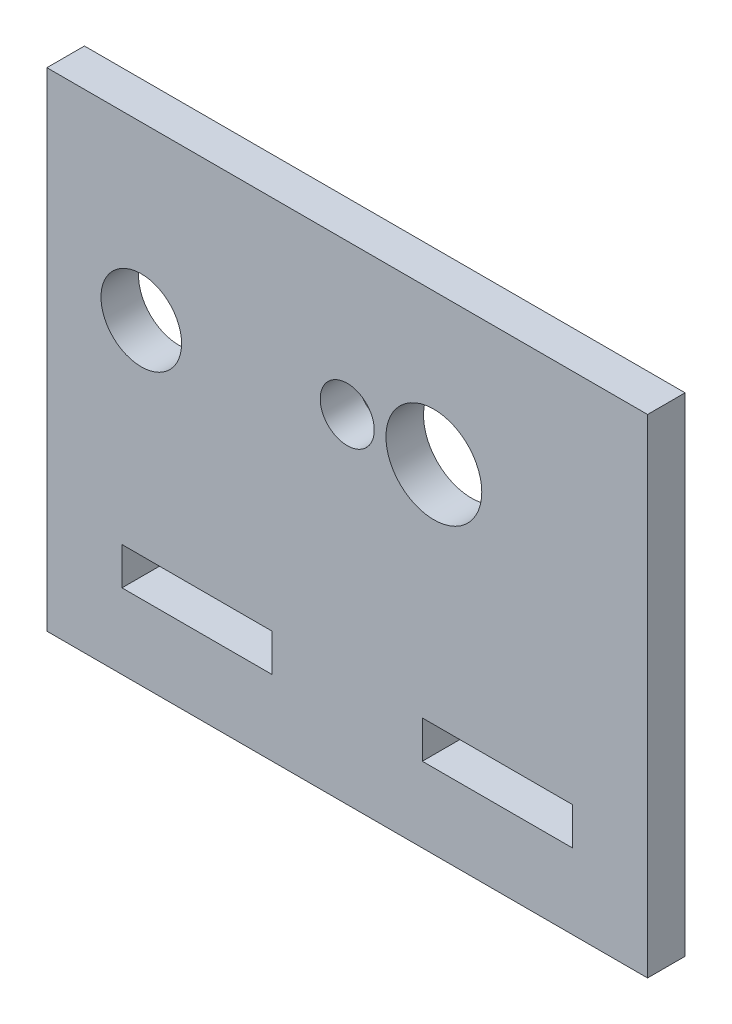
ISO-10303-21;
HEADER;
FILE_DESCRIPTION(('STEP AP214'),'2;1');
FILE_NAME('part.step','',(''),(''),'','','');
FILE_SCHEMA(('AUTOMOTIVE_DESIGN { 1 0 10303 214 1 1 1 1 }'));
ENDSEC;
DATA;
#1=APPLICATION_CONTEXT('core data for automotive mechanical design processes');
#2=APPLICATION_PROTOCOL_DEFINITION('international standard','automotive_design',2000,#1);
#3=PRODUCT_CONTEXT('',#1,'mechanical');
#4=PRODUCT('Part','Part','',(#3));
#5=PRODUCT_RELATED_PRODUCT_CATEGORY('part','',(#4));
#6=PRODUCT_DEFINITION_FORMATION('','',#4);
#7=PRODUCT_DEFINITION_CONTEXT('part definition',#1,'design');
#8=PRODUCT_DEFINITION('design','',#6,#7);
#9=PRODUCT_DEFINITION_SHAPE('','',#8);
#10=(LENGTH_UNIT() NAMED_UNIT(*) SI_UNIT(.MILLI.,.METRE.));
#11=(NAMED_UNIT(*) PLANE_ANGLE_UNIT() SI_UNIT($,.RADIAN.));
#12=(NAMED_UNIT(*) SI_UNIT($,.STERADIAN.) SOLID_ANGLE_UNIT());
#13=UNCERTAINTY_MEASURE_WITH_UNIT(LENGTH_MEASURE(1.E-05),#10,'distance_accuracy_value','');
#14=(GEOMETRIC_REPRESENTATION_CONTEXT(3) GLOBAL_UNCERTAINTY_ASSIGNED_CONTEXT((#13)) GLOBAL_UNIT_ASSIGNED_CONTEXT((#10,
#11,#12)) REPRESENTATION_CONTEXT('',''));
#15=CARTESIAN_POINT('',(0.,0.,0.));
#16=DIRECTION('',(0.,0.,1.));
#17=DIRECTION('',(1.,0.,0.));
#18=AXIS2_PLACEMENT_3D('',#15,#16,#17);
#19=CARTESIAN_POINT('',(0.,0.,3.175));
#20=DIRECTION('',(0.,0.,-1.));
#21=DIRECTION('',(-1.,0.,0.));
#22=AXIS2_PLACEMENT_3D('',#19,#20,#21);
#23=PLANE('',#22);
#24=CARTESIAN_POINT('',(25.4,28.575,3.175));
#25=DIRECTION('',(0.,0.,1.));
#26=DIRECTION('',(1.,0.,0.));
#27=AXIS2_PLACEMENT_3D('',#24,#25,#26);
#28=CIRCLE('',#27,2.286);
#29=CARTESIAN_POINT('',(27.686,28.575,3.175));
#30=VERTEX_POINT('',#29);
#31=EDGE_CURVE('E161',#30,#30,#28,.T.);
#32=ORIENTED_EDGE('',*,*,#31,.F.);
#33=EDGE_LOOP('',(#32));
#34=FACE_BOUND('',#33,.T.);
#35=DIRECTION('',(0.,-1.,0.));
#36=VECTOR('',#35,1.);
#37=CARTESIAN_POINT('',(6.35,6.35,3.175));
#38=LINE('',#37,#36);
#39=CARTESIAN_POINT('',(6.35,9.525,3.175));
#40=VERTEX_POINT('',#39);
#41=CARTESIAN_POINT('',(6.35,6.35,3.175));
#42=VERTEX_POINT('',#41);
#43=EDGE_CURVE('E167',#40,#42,#38,.T.);
#44=ORIENTED_EDGE('',*,*,#43,.F.);
#45=DIRECTION('',(-1.,0.,0.));
#46=VECTOR('',#45,1.);
#47=CARTESIAN_POINT('',(6.35,9.525,3.175));
#48=LINE('',#47,#46);
#49=CARTESIAN_POINT('',(19.05,9.525,3.175));
#50=VERTEX_POINT('',#49);
#51=EDGE_CURVE('E175',#50,#40,#48,.T.);
#52=ORIENTED_EDGE('',*,*,#51,.F.);
#53=DIRECTION('',(0.,1.,0.));
#54=VECTOR('',#53,1.);
#55=CARTESIAN_POINT('',(19.05,6.35,3.175));
#56=LINE('',#55,#54);
#57=CARTESIAN_POINT('',(19.05,6.35,3.175));
#58=VERTEX_POINT('',#57);
#59=EDGE_CURVE('E172',#58,#50,#56,.T.);
#60=ORIENTED_EDGE('',*,*,#59,.F.);
#61=DIRECTION('',(1.,0.,0.));
#62=VECTOR('',#61,1.);
#63=CARTESIAN_POINT('',(6.35,6.35,3.175));
#64=LINE('',#63,#62);
#65=EDGE_CURVE('E169',#42,#58,#64,.T.);
#66=ORIENTED_EDGE('',*,*,#65,.F.);
#67=EDGE_LOOP('',(#44,#52,#60,#66));
#68=FACE_BOUND('',#67,.T.);
#69=DIRECTION('',(1.,0.,0.));
#70=VECTOR('',#69,1.);
#71=CARTESIAN_POINT('',(0.,0.,3.175));
#72=LINE('',#71,#70);
#73=CARTESIAN_POINT('',(0.,0.,3.175));
#74=VERTEX_POINT('',#73);
#75=CARTESIAN_POINT('',(50.8,0.,3.175));
#76=VERTEX_POINT('',#75);
#77=EDGE_CURVE('E198',#74,#76,#72,.T.);
#78=ORIENTED_EDGE('',*,*,#77,.T.);
#79=DIRECTION('',(0.,1.,0.));
#80=VECTOR('',#79,1.);
#81=CARTESIAN_POINT('',(50.8,41.275,3.175));
#82=LINE('',#81,#80);
#83=CARTESIAN_POINT('',(50.8,41.275,3.175));
#84=VERTEX_POINT('',#83);
#85=EDGE_CURVE('E201',#76,#84,#82,.T.);
#86=ORIENTED_EDGE('',*,*,#85,.T.);
#87=DIRECTION('',(-1.,0.,0.));
#88=VECTOR('',#87,1.);
#89=CARTESIAN_POINT('',(0.,41.275,3.175));
#90=LINE('',#89,#88);
#91=CARTESIAN_POINT('',(0.,41.275,3.175));
#92=VERTEX_POINT('',#91);
#93=EDGE_CURVE('E204',#84,#92,#90,.T.);
#94=ORIENTED_EDGE('',*,*,#93,.T.);
#95=DIRECTION('',(0.,-1.,0.));
#96=VECTOR('',#95,1.);
#97=CARTESIAN_POINT('',(0.,0.,3.175));
#98=LINE('',#97,#96);
#99=EDGE_CURVE('E206',#92,#74,#98,.T.);
#100=ORIENTED_EDGE('',*,*,#99,.T.);
#101=EDGE_LOOP('',(#78,#86,#94,#100));
#102=FACE_BOUND('',#101,.T.);
#103=DIRECTION('',(0.,-1.,0.));
#104=VECTOR('',#103,1.);
#105=CARTESIAN_POINT('',(31.75,6.35,3.175));
#106=LINE('',#105,#104);
#107=CARTESIAN_POINT('',(31.75,9.525,3.175));
#108=VERTEX_POINT('',#107);
#109=CARTESIAN_POINT('',(31.75,6.35,3.175));
#110=VERTEX_POINT('',#109);
#111=EDGE_CURVE('E122',#108,#110,#106,.T.);
#112=ORIENTED_EDGE('',*,*,#111,.F.);
#113=DIRECTION('',(-1.,0.,0.));
#114=VECTOR('',#113,1.);
#115=CARTESIAN_POINT('',(31.75,9.525,3.175));
#116=LINE('',#115,#114);
#117=CARTESIAN_POINT('',(44.45,9.525,3.175));
#118=VERTEX_POINT('',#117);
#119=EDGE_CURVE('E145',#118,#108,#116,.T.);
#120=ORIENTED_EDGE('',*,*,#119,.F.);
#121=DIRECTION('',(0.,1.,0.));
#122=VECTOR('',#121,1.);
#123=CARTESIAN_POINT('',(44.45,6.35,3.175));
#124=LINE('',#123,#122);
#125=CARTESIAN_POINT('',(44.45,6.35,3.175));
#126=VERTEX_POINT('',#125);
#127=EDGE_CURVE('E143',#126,#118,#124,.T.);
#128=ORIENTED_EDGE('',*,*,#127,.F.);
#129=DIRECTION('',(1.,0.,0.));
#130=VECTOR('',#129,1.);
#131=CARTESIAN_POINT('',(31.75,6.35,3.175));
#132=LINE('',#131,#130);
#133=EDGE_CURVE('E130',#110,#126,#132,.T.);
#134=ORIENTED_EDGE('',*,*,#133,.F.);
#135=EDGE_LOOP('',(#112,#120,#128,#134));
#136=FACE_BOUND('',#135,.T.);
#137=CARTESIAN_POINT('',(7.98153170981285,26.7617762768061,3.175));
#138=DIRECTION('',(0.,0.,1.));
#139=DIRECTION('',(1.,0.,0.));
#140=AXIS2_PLACEMENT_3D('',#137,#138,#139);
#141=CIRCLE('',#140,3.40767189324745);
#142=CARTESIAN_POINT('',(11.3892036030603,26.7617762768061,3.175));
#143=VERTEX_POINT('',#142);
#144=EDGE_CURVE('E151',#143,#143,#141,.T.);
#145=ORIENTED_EDGE('',*,*,#144,.F.);
#146=EDGE_LOOP('',(#145));
#147=FACE_BOUND('',#146,.T.);
#148=CARTESIAN_POINT('',(32.7272762312895,28.575,3.175));
#149=DIRECTION('',(0.,0.,1.));
#150=DIRECTION('',(1.,0.,0.));
#151=AXIS2_PLACEMENT_3D('',#148,#149,#150);
#152=CIRCLE('',#151,4.05169990793572);
#153=CARTESIAN_POINT('',(36.7789761392253,28.575,3.175));
#154=VERTEX_POINT('',#153);
#155=EDGE_CURVE('E320',#154,#154,#152,.T.);
#156=ORIENTED_EDGE('',*,*,#155,.F.);
#157=EDGE_LOOP('',(#156));
#158=FACE_BOUND('',#157,.T.);
#159=ADVANCED_FACE('F33',(#34,#68,#102,#136,#147,#158),#23,.F.);
#160=CARTESIAN_POINT('',(0.,0.,0.));
#161=DIRECTION('',(0.,0.,-1.));
#162=DIRECTION('',(-1.,0.,0.));
#163=AXIS2_PLACEMENT_3D('',#160,#161,#162);
#164=PLANE('',#163);
#165=CARTESIAN_POINT('',(7.98153170981285,26.7617762768061,0.));
#166=DIRECTION('',(0.,0.,1.));
#167=DIRECTION('',(1.,0.,0.));
#168=AXIS2_PLACEMENT_3D('',#165,#166,#167);
#169=CIRCLE('',#168,3.40767189324745);
#170=CARTESIAN_POINT('',(11.3892036030603,26.7617762768061,0.));
#171=VERTEX_POINT('',#170);
#172=EDGE_CURVE('E326',#171,#171,#169,.T.);
#173=ORIENTED_EDGE('',*,*,#172,.T.);
#174=EDGE_LOOP('',(#173));
#175=FACE_BOUND('',#174,.T.);
#176=DIRECTION('',(-1.,0.,0.));
#177=VECTOR('',#176,1.);
#178=CARTESIAN_POINT('',(6.35,9.525,0.));
#179=LINE('',#178,#177);
#180=CARTESIAN_POINT('',(19.05,9.525,0.));
#181=VERTEX_POINT('',#180);
#182=CARTESIAN_POINT('',(6.35,9.525,0.));
#183=VERTEX_POINT('',#182);
#184=EDGE_CURVE('E170',#181,#183,#179,.T.);
#185=ORIENTED_EDGE('',*,*,#184,.T.);
#186=DIRECTION('',(0.,-1.,0.));
#187=VECTOR('',#186,1.);
#188=CARTESIAN_POINT('',(6.35,6.35,0.));
#189=LINE('',#188,#187);
#190=CARTESIAN_POINT('',(6.35,6.35,0.));
#191=VERTEX_POINT('',#190);
#192=EDGE_CURVE('E164',#183,#191,#189,.T.);
#193=ORIENTED_EDGE('',*,*,#192,.T.);
#194=DIRECTION('',(1.,0.,0.));
#195=VECTOR('',#194,1.);
#196=CARTESIAN_POINT('',(6.35,6.35,0.));
#197=LINE('',#196,#195);
#198=CARTESIAN_POINT('',(19.05,6.35,0.));
#199=VERTEX_POINT('',#198);
#200=EDGE_CURVE('E180',#191,#199,#197,.T.);
#201=ORIENTED_EDGE('',*,*,#200,.T.);
#202=DIRECTION('',(0.,1.,0.));
#203=VECTOR('',#202,1.);
#204=CARTESIAN_POINT('',(19.05,6.35,0.));
#205=LINE('',#204,#203);
#206=EDGE_CURVE('E183',#199,#181,#205,.T.);
#207=ORIENTED_EDGE('',*,*,#206,.T.);
#208=EDGE_LOOP('',(#185,#193,#201,#207));
#209=FACE_BOUND('',#208,.T.);
#210=DIRECTION('',(1.,0.,0.));
#211=VECTOR('',#210,1.);
#212=CARTESIAN_POINT('',(0.,0.,0.));
#213=LINE('',#212,#211);
#214=CARTESIAN_POINT('',(0.,0.,0.));
#215=VERTEX_POINT('',#214);
#216=CARTESIAN_POINT('',(50.8,0.,0.));
#217=VERTEX_POINT('',#216);
#218=EDGE_CURVE('E197',#215,#217,#213,.T.);
#219=ORIENTED_EDGE('',*,*,#218,.F.);
#220=DIRECTION('',(0.,-1.,0.));
#221=VECTOR('',#220,1.);
#222=CARTESIAN_POINT('',(0.,0.,0.));
#223=LINE('',#222,#221);
#224=CARTESIAN_POINT('',(0.,41.275,0.));
#225=VERTEX_POINT('',#224);
#226=EDGE_CURVE('E202',#225,#215,#223,.T.);
#227=ORIENTED_EDGE('',*,*,#226,.F.);
#228=DIRECTION('',(-1.,0.,0.));
#229=VECTOR('',#228,1.);
#230=CARTESIAN_POINT('',(0.,41.275,0.));
#231=LINE('',#230,#229);
#232=CARTESIAN_POINT('',(50.8,41.275,0.));
#233=VERTEX_POINT('',#232);
#234=EDGE_CURVE('E213',#233,#225,#231,.T.);
#235=ORIENTED_EDGE('',*,*,#234,.F.);
#236=DIRECTION('',(0.,1.,0.));
#237=VECTOR('',#236,1.);
#238=CARTESIAN_POINT('',(50.8,41.275,0.));
#239=LINE('',#238,#237);
#240=EDGE_CURVE('E211',#217,#233,#239,.T.);
#241=ORIENTED_EDGE('',*,*,#240,.F.);
#242=EDGE_LOOP('',(#219,#227,#235,#241));
#243=FACE_BOUND('',#242,.T.);
#244=CARTESIAN_POINT('',(25.4,28.575,0.));
#245=DIRECTION('',(0.,0.,1.));
#246=DIRECTION('',(1.,0.,0.));
#247=AXIS2_PLACEMENT_3D('',#244,#245,#246);
#248=CIRCLE('',#247,2.286);
#249=CARTESIAN_POINT('',(27.686,28.575,0.));
#250=VERTEX_POINT('',#249);
#251=EDGE_CURVE('E138',#250,#250,#248,.T.);
#252=ORIENTED_EDGE('',*,*,#251,.T.);
#253=EDGE_LOOP('',(#252));
#254=FACE_BOUND('',#253,.T.);
#255=DIRECTION('',(-1.,0.,0.));
#256=VECTOR('',#255,1.);
#257=CARTESIAN_POINT('',(31.75,9.525,0.));
#258=LINE('',#257,#256);
#259=CARTESIAN_POINT('',(44.45,9.525,0.));
#260=VERTEX_POINT('',#259);
#261=CARTESIAN_POINT('',(31.75,9.525,0.));
#262=VERTEX_POINT('',#261);
#263=EDGE_CURVE('E131',#260,#262,#258,.T.);
#264=ORIENTED_EDGE('',*,*,#263,.T.);
#265=DIRECTION('',(0.,-1.,0.));
#266=VECTOR('',#265,1.);
#267=CARTESIAN_POINT('',(31.75,6.35,0.));
#268=LINE('',#267,#266);
#269=CARTESIAN_POINT('',(31.75,6.35,0.));
#270=VERTEX_POINT('',#269);
#271=EDGE_CURVE('E56',#262,#270,#268,.T.);
#272=ORIENTED_EDGE('',*,*,#271,.T.);
#273=DIRECTION('',(1.,0.,0.));
#274=VECTOR('',#273,1.);
#275=CARTESIAN_POINT('',(31.75,6.35,0.));
#276=LINE('',#275,#274);
#277=CARTESIAN_POINT('',(44.45,6.35,0.));
#278=VERTEX_POINT('',#277);
#279=EDGE_CURVE('E137',#270,#278,#276,.T.);
#280=ORIENTED_EDGE('',*,*,#279,.T.);
#281=DIRECTION('',(0.,1.,0.));
#282=VECTOR('',#281,1.);
#283=CARTESIAN_POINT('',(44.45,6.35,0.));
#284=LINE('',#283,#282);
#285=EDGE_CURVE('E153',#278,#260,#284,.T.);
#286=ORIENTED_EDGE('',*,*,#285,.T.);
#287=EDGE_LOOP('',(#264,#272,#280,#286));
#288=FACE_BOUND('',#287,.T.);
#289=CARTESIAN_POINT('',(32.7272762312895,28.575,0.));
#290=DIRECTION('',(0.,0.,1.));
#291=DIRECTION('',(1.,0.,0.));
#292=AXIS2_PLACEMENT_3D('',#289,#290,#291);
#293=CIRCLE('',#292,4.05169990793572);
#294=CARTESIAN_POINT('',(36.7789761392253,28.575,0.));
#295=VERTEX_POINT('',#294);
#296=EDGE_CURVE('E323',#295,#295,#293,.T.);
#297=ORIENTED_EDGE('',*,*,#296,.T.);
#298=EDGE_LOOP('',(#297));
#299=FACE_BOUND('',#298,.T.);
#300=ADVANCED_FACE('F231',(#175,#209,#243,#254,#288,#299),#164,.T.);
#301=CARTESIAN_POINT('',(0.,0.,3.175));
#302=DIRECTION('',(0.,1.,0.));
#303=DIRECTION('',(0.,0.,1.));
#304=AXIS2_PLACEMENT_3D('',#301,#302,#303);
#305=PLANE('',#304);
#306=ORIENTED_EDGE('',*,*,#218,.T.);
#307=DIRECTION('',(0.,0.,-1.));
#308=VECTOR('',#307,1.);
#309=CARTESIAN_POINT('',(50.8,0.,3.175));
#310=LINE('',#309,#308);
#311=EDGE_CURVE('E11',#76,#217,#310,.T.);
#312=ORIENTED_EDGE('',*,*,#311,.F.);
#313=ORIENTED_EDGE('',*,*,#77,.F.);
#314=DIRECTION('',(0.,0.,-1.));
#315=VECTOR('',#314,1.);
#316=CARTESIAN_POINT('',(0.,0.,3.175));
#317=LINE('',#316,#315);
#318=EDGE_CURVE('E208',#74,#215,#317,.T.);
#319=ORIENTED_EDGE('',*,*,#318,.T.);
#320=EDGE_LOOP('',(#306,#312,#313,#319));
#321=FACE_BOUND('',#320,.T.);
#322=ADVANCED_FACE('F35',(#321),#305,.F.);
#323=CARTESIAN_POINT('',(50.8,41.275,3.175));
#324=DIRECTION('',(-1.,0.,0.));
#325=DIRECTION('',(0.,0.,1.));
#326=AXIS2_PLACEMENT_3D('',#323,#324,#325);
#327=PLANE('',#326);
#328=ORIENTED_EDGE('',*,*,#240,.T.);
#329=DIRECTION('',(0.,0.,-1.));
#330=VECTOR('',#329,1.);
#331=CARTESIAN_POINT('',(50.8,41.275,3.175));
#332=LINE('',#331,#330);
#333=EDGE_CURVE('E41',#84,#233,#332,.T.);
#334=ORIENTED_EDGE('',*,*,#333,.F.);
#335=ORIENTED_EDGE('',*,*,#85,.F.);
#336=ORIENTED_EDGE('',*,*,#311,.T.);
#337=EDGE_LOOP('',(#328,#334,#335,#336));
#338=FACE_BOUND('',#337,.T.);
#339=ADVANCED_FACE('F241',(#338),#327,.F.);
#340=CARTESIAN_POINT('',(0.,41.275,3.175));
#341=DIRECTION('',(0.,-1.,0.));
#342=DIRECTION('',(0.,0.,-1.));
#343=AXIS2_PLACEMENT_3D('',#340,#341,#342);
#344=PLANE('',#343);
#345=ORIENTED_EDGE('',*,*,#234,.T.);
#346=DIRECTION('',(0.,0.,-1.));
#347=VECTOR('',#346,1.);
#348=CARTESIAN_POINT('',(0.,41.275,3.175));
#349=LINE('',#348,#347);
#350=EDGE_CURVE('E218',#92,#225,#349,.T.);
#351=ORIENTED_EDGE('',*,*,#350,.F.);
#352=ORIENTED_EDGE('',*,*,#93,.F.);
#353=ORIENTED_EDGE('',*,*,#333,.T.);
#354=EDGE_LOOP('',(#345,#351,#352,#353));
#355=FACE_BOUND('',#354,.T.);
#356=ADVANCED_FACE('F225',(#355),#344,.F.);
#357=CARTESIAN_POINT('',(0.,0.,3.175));
#358=DIRECTION('',(1.,0.,0.));
#359=DIRECTION('',(0.,0.,-1.));
#360=AXIS2_PLACEMENT_3D('',#357,#358,#359);
#361=PLANE('',#360);
#362=ORIENTED_EDGE('',*,*,#226,.T.);
#363=ORIENTED_EDGE('',*,*,#318,.F.);
#364=ORIENTED_EDGE('',*,*,#99,.F.);
#365=ORIENTED_EDGE('',*,*,#350,.T.);
#366=EDGE_LOOP('',(#362,#363,#364,#365));
#367=FACE_BOUND('',#366,.T.);
#368=ADVANCED_FACE('F235',(#367),#361,.F.);
#369=CARTESIAN_POINT('',(6.35,6.35,3.175));
#370=DIRECTION('',(1.,0.,0.));
#371=DIRECTION('',(0.,1.,0.));
#372=AXIS2_PLACEMENT_3D('',#369,#370,#371);
#373=PLANE('',#372);
#374=ORIENTED_EDGE('',*,*,#192,.F.);
#375=DIRECTION('',(0.,0.,-1.));
#376=VECTOR('',#375,1.);
#377=CARTESIAN_POINT('',(6.35,9.525,3.175));
#378=LINE('',#377,#376);
#379=EDGE_CURVE('E177',#40,#183,#378,.T.);
#380=ORIENTED_EDGE('',*,*,#379,.F.);
#381=ORIENTED_EDGE('',*,*,#43,.T.);
#382=DIRECTION('',(0.,0.,-1.));
#383=VECTOR('',#382,1.);
#384=CARTESIAN_POINT('',(6.35,6.35,3.175));
#385=LINE('',#384,#383);
#386=EDGE_CURVE('E194',#42,#191,#385,.T.);
#387=ORIENTED_EDGE('',*,*,#386,.T.);
#388=EDGE_LOOP('',(#374,#380,#381,#387));
#389=FACE_BOUND('',#388,.T.);
#390=ADVANCED_FACE('F259',(#389),#373,.T.);
#391=CARTESIAN_POINT('',(6.35,6.35,3.175));
#392=DIRECTION('',(0.,1.,0.));
#393=DIRECTION('',(0.,0.,1.));
#394=AXIS2_PLACEMENT_3D('',#391,#392,#393);
#395=PLANE('',#394);
#396=ORIENTED_EDGE('',*,*,#200,.F.);
#397=ORIENTED_EDGE('',*,*,#386,.F.);
#398=ORIENTED_EDGE('',*,*,#65,.T.);
#399=DIRECTION('',(0.,0.,-1.));
#400=VECTOR('',#399,1.);
#401=CARTESIAN_POINT('',(19.05,6.35,3.175));
#402=LINE('',#401,#400);
#403=EDGE_CURVE('E192',#58,#199,#402,.T.);
#404=ORIENTED_EDGE('',*,*,#403,.T.);
#405=EDGE_LOOP('',(#396,#397,#398,#404));
#406=FACE_BOUND('',#405,.T.);
#407=ADVANCED_FACE('F266',(#406),#395,.T.);
#408=CARTESIAN_POINT('',(19.05,6.35,3.175));
#409=DIRECTION('',(-1.,0.,0.));
#410=DIRECTION('',(0.,0.,1.));
#411=AXIS2_PLACEMENT_3D('',#408,#409,#410);
#412=PLANE('',#411);
#413=ORIENTED_EDGE('',*,*,#206,.F.);
#414=ORIENTED_EDGE('',*,*,#403,.F.);
#415=ORIENTED_EDGE('',*,*,#59,.T.);
#416=DIRECTION('',(0.,0.,-1.));
#417=VECTOR('',#416,1.);
#418=CARTESIAN_POINT('',(19.05,9.525,3.175));
#419=LINE('',#418,#417);
#420=EDGE_CURVE('E190',#50,#181,#419,.T.);
#421=ORIENTED_EDGE('',*,*,#420,.T.);
#422=EDGE_LOOP('',(#413,#414,#415,#421));
#423=FACE_BOUND('',#422,.T.);
#424=ADVANCED_FACE('F271',(#423),#412,.T.);
#425=CARTESIAN_POINT('',(6.35,9.525,3.175));
#426=DIRECTION('',(0.,-1.,0.));
#427=DIRECTION('',(0.,0.,-1.));
#428=AXIS2_PLACEMENT_3D('',#425,#426,#427);
#429=PLANE('',#428);
#430=ORIENTED_EDGE('',*,*,#184,.F.);
#431=ORIENTED_EDGE('',*,*,#420,.F.);
#432=ORIENTED_EDGE('',*,*,#51,.T.);
#433=ORIENTED_EDGE('',*,*,#379,.T.);
#434=EDGE_LOOP('',(#430,#431,#432,#433));
#435=FACE_BOUND('',#434,.T.);
#436=ADVANCED_FACE('F279',(#435),#429,.T.);
#437=CARTESIAN_POINT('',(25.4,28.575,3.175));
#438=DIRECTION('',(0.,0.,-1.));
#439=DIRECTION('',(-1.,0.,0.));
#440=AXIS2_PLACEMENT_3D('',#437,#438,#439);
#441=CYLINDRICAL_SURFACE('',#440,2.286);
#442=ORIENTED_EDGE('',*,*,#31,.T.);
#443=EDGE_LOOP('',(#442));
#444=FACE_BOUND('',#443,.T.);
#445=ORIENTED_EDGE('',*,*,#251,.F.);
#446=EDGE_LOOP('',(#445));
#447=FACE_BOUND('',#446,.T.);
#448=ADVANCED_FACE('F291',(#444,#447),#441,.F.);
#449=CARTESIAN_POINT('',(31.75,6.35,3.175));
#450=DIRECTION('',(1.,0.,0.));
#451=DIRECTION('',(0.,0.,-1.));
#452=AXIS2_PLACEMENT_3D('',#449,#450,#451);
#453=PLANE('',#452);
#454=ORIENTED_EDGE('',*,*,#271,.F.);
#455=DIRECTION('',(0.,0.,-1.));
#456=VECTOR('',#455,1.);
#457=CARTESIAN_POINT('',(31.75,9.525,3.175));
#458=LINE('',#457,#456);
#459=EDGE_CURVE('E126',#108,#262,#458,.T.);
#460=ORIENTED_EDGE('',*,*,#459,.F.);
#461=ORIENTED_EDGE('',*,*,#111,.T.);
#462=DIRECTION('',(0.,0.,-1.));
#463=VECTOR('',#462,1.);
#464=CARTESIAN_POINT('',(31.75,6.35,3.175));
#465=LINE('',#464,#463);
#466=EDGE_CURVE('E125',#110,#270,#465,.T.);
#467=ORIENTED_EDGE('',*,*,#466,.T.);
#468=EDGE_LOOP('',(#454,#460,#461,#467));
#469=FACE_BOUND('',#468,.T.);
#470=ADVANCED_FACE('F124',(#469),#453,.T.);
#471=CARTESIAN_POINT('',(31.75,6.35,3.175));
#472=DIRECTION('',(0.,1.,0.));
#473=DIRECTION('',(0.,0.,1.));
#474=AXIS2_PLACEMENT_3D('',#471,#472,#473);
#475=PLANE('',#474);
#476=ORIENTED_EDGE('',*,*,#279,.F.);
#477=ORIENTED_EDGE('',*,*,#466,.F.);
#478=ORIENTED_EDGE('',*,*,#133,.T.);
#479=DIRECTION('',(0.,0.,-1.));
#480=VECTOR('',#479,1.);
#481=CARTESIAN_POINT('',(44.45,6.35,3.175));
#482=LINE('',#481,#480);
#483=EDGE_CURVE('E139',#126,#278,#482,.T.);
#484=ORIENTED_EDGE('',*,*,#483,.T.);
#485=EDGE_LOOP('',(#476,#477,#478,#484));
#486=FACE_BOUND('',#485,.T.);
#487=ADVANCED_FACE('F134',(#486),#475,.T.);
#488=CARTESIAN_POINT('',(44.45,6.35,3.175));
#489=DIRECTION('',(-1.,0.,0.));
#490=DIRECTION('',(0.,0.,1.));
#491=AXIS2_PLACEMENT_3D('',#488,#489,#490);
#492=PLANE('',#491);
#493=ORIENTED_EDGE('',*,*,#285,.F.);
#494=ORIENTED_EDGE('',*,*,#483,.F.);
#495=ORIENTED_EDGE('',*,*,#127,.T.);
#496=DIRECTION('',(0.,0.,-1.));
#497=VECTOR('',#496,1.);
#498=CARTESIAN_POINT('',(44.45,9.525,3.175));
#499=LINE('',#498,#497);
#500=EDGE_CURVE('E48',#118,#260,#499,.T.);
#501=ORIENTED_EDGE('',*,*,#500,.T.);
#502=EDGE_LOOP('',(#493,#494,#495,#501));
#503=FACE_BOUND('',#502,.T.);
#504=ADVANCED_FACE('F301',(#503),#492,.T.);
#505=CARTESIAN_POINT('',(31.75,9.525,3.175));
#506=DIRECTION('',(0.,-1.,0.));
#507=DIRECTION('',(0.,0.,-1.));
#508=AXIS2_PLACEMENT_3D('',#505,#506,#507);
#509=PLANE('',#508);
#510=ORIENTED_EDGE('',*,*,#263,.F.);
#511=ORIENTED_EDGE('',*,*,#500,.F.);
#512=ORIENTED_EDGE('',*,*,#119,.T.);
#513=ORIENTED_EDGE('',*,*,#459,.T.);
#514=EDGE_LOOP('',(#510,#511,#512,#513));
#515=FACE_BOUND('',#514,.T.);
#516=ADVANCED_FACE('F304',(#515),#509,.T.);
#517=CARTESIAN_POINT('',(7.98153170981285,26.7617762768061,3.175));
#518=DIRECTION('',(0.,0.,-1.));
#519=DIRECTION('',(-1.,0.,0.));
#520=AXIS2_PLACEMENT_3D('',#517,#518,#519);
#521=CYLINDRICAL_SURFACE('',#520,3.40767189324745);
#522=ORIENTED_EDGE('',*,*,#144,.T.);
#523=EDGE_LOOP('',(#522));
#524=FACE_BOUND('',#523,.T.);
#525=ORIENTED_EDGE('',*,*,#172,.F.);
#526=EDGE_LOOP('',(#525));
#527=FACE_BOUND('',#526,.T.);
#528=ADVANCED_FACE('F308',(#524,#527),#521,.F.);
#529=CARTESIAN_POINT('',(32.7272762312895,28.575,3.175));
#530=DIRECTION('',(0.,0.,-1.));
#531=DIRECTION('',(-1.,0.,0.));
#532=AXIS2_PLACEMENT_3D('',#529,#530,#531);
#533=CYLINDRICAL_SURFACE('',#532,4.05169990793572);
#534=ORIENTED_EDGE('',*,*,#155,.T.);
#535=EDGE_LOOP('',(#534));
#536=FACE_BOUND('',#535,.T.);
#537=ORIENTED_EDGE('',*,*,#296,.F.);
#538=EDGE_LOOP('',(#537));
#539=FACE_BOUND('',#538,.T.);
#540=ADVANCED_FACE('F311',(#536,#539),#533,.F.);
#541=CLOSED_SHELL('',(#159,#300,#322,#339,#356,#368,#390,#407,#424,#436,#448,#470,#487,#504,
#516,#528,#540));
#542=MANIFOLD_SOLID_BREP('B2',#541);
#543=ADVANCED_BREP_SHAPE_REPRESENTATION('',(#18,#542),#14);
#544=SHAPE_DEFINITION_REPRESENTATION(#9,#543);
ENDSEC;
END-ISO-10303-21;
